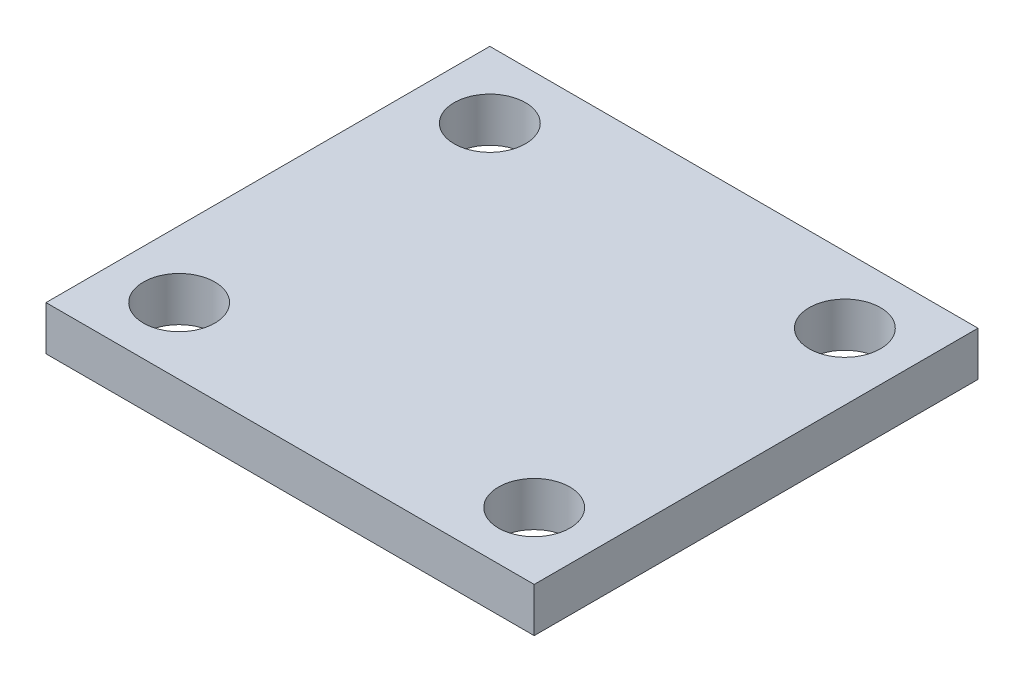
ISO-10303-21;
HEADER;
FILE_DESCRIPTION(('STEP AP214'),'2;1');
FILE_NAME('part.step','',(''),(''),'','','');
FILE_SCHEMA(('AUTOMOTIVE_DESIGN { 1 0 10303 214 1 1 1 1 }'));
ENDSEC;
DATA;
#1=APPLICATION_CONTEXT('core data for automotive mechanical design processes');
#2=APPLICATION_PROTOCOL_DEFINITION('international standard','automotive_design',2000,#1);
#3=PRODUCT_CONTEXT('',#1,'mechanical');
#4=PRODUCT('Part','Part','',(#3));
#5=PRODUCT_RELATED_PRODUCT_CATEGORY('part','',(#4));
#6=PRODUCT_DEFINITION_FORMATION('','',#4);
#7=PRODUCT_DEFINITION_CONTEXT('part definition',#1,'design');
#8=PRODUCT_DEFINITION('design','',#6,#7);
#9=PRODUCT_DEFINITION_SHAPE('','',#8);
#10=(LENGTH_UNIT() NAMED_UNIT(*) SI_UNIT(.MILLI.,.METRE.));
#11=(NAMED_UNIT(*) PLANE_ANGLE_UNIT() SI_UNIT($,.RADIAN.));
#12=(NAMED_UNIT(*) SI_UNIT($,.STERADIAN.) SOLID_ANGLE_UNIT());
#13=UNCERTAINTY_MEASURE_WITH_UNIT(LENGTH_MEASURE(1.E-05),#10,'distance_accuracy_value','');
#14=(GEOMETRIC_REPRESENTATION_CONTEXT(3) GLOBAL_UNCERTAINTY_ASSIGNED_CONTEXT((#13)) GLOBAL_UNIT_ASSIGNED_CONTEXT((#10,
#11,#12)) REPRESENTATION_CONTEXT('',''));
#15=CARTESIAN_POINT('',(0.,0.,0.));
#16=DIRECTION('',(0.,0.,1.));
#17=DIRECTION('',(1.,0.,0.));
#18=AXIS2_PLACEMENT_3D('',#15,#16,#17);
#19=CARTESIAN_POINT('',(17.4625,1.5875,15.875));
#20=DIRECTION('',(-1.,0.,0.));
#21=DIRECTION('',(0.,0.,1.));
#22=AXIS2_PLACEMENT_3D('',#19,#20,#21);
#23=PLANE('',#22);
#24=DIRECTION('',(0.,0.,-1.));
#25=VECTOR('',#24,1.);
#26=CARTESIAN_POINT('',(17.4625,-1.5875,15.875));
#27=LINE('',#26,#25);
#28=CARTESIAN_POINT('',(17.4625,-1.5875,15.875));
#29=VERTEX_POINT('',#28);
#30=CARTESIAN_POINT('',(17.4625,-1.5875,-15.875));
#31=VERTEX_POINT('',#30);
#32=EDGE_CURVE('E96',#29,#31,#27,.T.);
#33=ORIENTED_EDGE('',*,*,#32,.T.);
#34=DIRECTION('',(0.,-1.,0.));
#35=VECTOR('',#34,1.);
#36=CARTESIAN_POINT('',(17.4625,1.5875,-15.875));
#37=LINE('',#36,#35);
#38=CARTESIAN_POINT('',(17.4625,1.5875,-15.875));
#39=VERTEX_POINT('',#38);
#40=EDGE_CURVE('E11',#39,#31,#37,.T.);
#41=ORIENTED_EDGE('',*,*,#40,.F.);
#42=DIRECTION('',(0.,0.,-1.));
#43=VECTOR('',#42,1.);
#44=CARTESIAN_POINT('',(17.4625,1.5875,15.875));
#45=LINE('',#44,#43);
#46=CARTESIAN_POINT('',(17.4625,1.5875,15.875));
#47=VERTEX_POINT('',#46);
#48=EDGE_CURVE('E84',#47,#39,#45,.T.);
#49=ORIENTED_EDGE('',*,*,#48,.F.);
#50=DIRECTION('',(0.,-1.,0.));
#51=VECTOR('',#50,1.);
#52=CARTESIAN_POINT('',(17.4625,1.5875,15.875));
#53=LINE('',#52,#51);
#54=EDGE_CURVE('E92',#47,#29,#53,.T.);
#55=ORIENTED_EDGE('',*,*,#54,.T.);
#56=EDGE_LOOP('',(#33,#41,#49,#55));
#57=FACE_BOUND('',#56,.T.);
#58=ADVANCED_FACE('F33',(#57),#23,.F.);
#59=CARTESIAN_POINT('',(-17.4625,1.5875,-15.875));
#60=DIRECTION('',(0.,0.,1.));
#61=DIRECTION('',(1.,0.,0.));
#62=AXIS2_PLACEMENT_3D('',#59,#60,#61);
#63=PLANE('',#62);
#64=DIRECTION('',(-1.,0.,0.));
#65=VECTOR('',#64,1.);
#66=CARTESIAN_POINT('',(-17.4625,-1.5875,-15.875));
#67=LINE('',#66,#65);
#68=CARTESIAN_POINT('',(-17.4625,-1.5875,-15.875));
#69=VERTEX_POINT('',#68);
#70=EDGE_CURVE('E88',#31,#69,#67,.T.);
#71=ORIENTED_EDGE('',*,*,#70,.T.);
#72=DIRECTION('',(0.,-1.,0.));
#73=VECTOR('',#72,1.);
#74=CARTESIAN_POINT('',(-17.4625,1.5875,-15.875));
#75=LINE('',#74,#73);
#76=CARTESIAN_POINT('',(-17.4625,1.5875,-15.875));
#77=VERTEX_POINT('',#76);
#78=EDGE_CURVE('E41',#77,#69,#75,.T.);
#79=ORIENTED_EDGE('',*,*,#78,.F.);
#80=DIRECTION('',(-1.,0.,0.));
#81=VECTOR('',#80,1.);
#82=CARTESIAN_POINT('',(-17.4625,1.5875,-15.875));
#83=LINE('',#82,#81);
#84=EDGE_CURVE('E79',#39,#77,#83,.T.);
#85=ORIENTED_EDGE('',*,*,#84,.F.);
#86=ORIENTED_EDGE('',*,*,#40,.T.);
#87=EDGE_LOOP('',(#71,#79,#85,#86));
#88=FACE_BOUND('',#87,.T.);
#89=ADVANCED_FACE('F87',(#88),#63,.F.);
#90=CARTESIAN_POINT('',(-17.4625,1.5875,15.875));
#91=DIRECTION('',(1.,0.,0.));
#92=DIRECTION('',(0.,0.,-1.));
#93=AXIS2_PLACEMENT_3D('',#90,#91,#92);
#94=PLANE('',#93);
#95=DIRECTION('',(0.,0.,1.));
#96=VECTOR('',#95,1.);
#97=CARTESIAN_POINT('',(-17.4625,-1.5875,15.875));
#98=LINE('',#97,#96);
#99=CARTESIAN_POINT('',(-17.4625,-1.5875,15.875));
#100=VERTEX_POINT('',#99);
#101=EDGE_CURVE('E66',#69,#100,#98,.T.);
#102=ORIENTED_EDGE('',*,*,#101,.T.);
#103=DIRECTION('',(0.,-1.,0.));
#104=VECTOR('',#103,1.);
#105=CARTESIAN_POINT('',(-17.4625,1.5875,15.875));
#106=LINE('',#105,#104);
#107=CARTESIAN_POINT('',(-17.4625,1.5875,15.875));
#108=VERTEX_POINT('',#107);
#109=EDGE_CURVE('E89',#108,#100,#106,.T.);
#110=ORIENTED_EDGE('',*,*,#109,.F.);
#111=DIRECTION('',(0.,0.,1.));
#112=VECTOR('',#111,1.);
#113=CARTESIAN_POINT('',(-17.4625,1.5875,15.875));
#114=LINE('',#113,#112);
#115=EDGE_CURVE('E82',#77,#108,#114,.T.);
#116=ORIENTED_EDGE('',*,*,#115,.F.);
#117=ORIENTED_EDGE('',*,*,#78,.T.);
#118=EDGE_LOOP('',(#102,#110,#116,#117));
#119=FACE_BOUND('',#118,.T.);
#120=ADVANCED_FACE('F90',(#119),#94,.F.);
#121=CARTESIAN_POINT('',(-17.4625,1.5875,15.875));
#122=DIRECTION('',(0.,0.,-1.));
#123=DIRECTION('',(-1.,0.,0.));
#124=AXIS2_PLACEMENT_3D('',#121,#122,#123);
#125=PLANE('',#124);
#126=DIRECTION('',(1.,0.,0.));
#127=VECTOR('',#126,1.);
#128=CARTESIAN_POINT('',(-17.4625,-1.5875,15.875));
#129=LINE('',#128,#127);
#130=EDGE_CURVE('E72',#100,#29,#129,.T.);
#131=ORIENTED_EDGE('',*,*,#130,.T.);
#132=ORIENTED_EDGE('',*,*,#54,.F.);
#133=DIRECTION('',(1.,0.,0.));
#134=VECTOR('',#133,1.);
#135=CARTESIAN_POINT('',(-17.4625,1.5875,15.875));
#136=LINE('',#135,#134);
#137=EDGE_CURVE('E49',#108,#47,#136,.T.);
#138=ORIENTED_EDGE('',*,*,#137,.F.);
#139=ORIENTED_EDGE('',*,*,#109,.T.);
#140=EDGE_LOOP('',(#131,#132,#138,#139));
#141=FACE_BOUND('',#140,.T.);
#142=ADVANCED_FACE('F104',(#141),#125,.F.);
#143=CARTESIAN_POINT('',(0.,1.5875,0.));
#144=DIRECTION('',(0.,-1.,0.));
#145=DIRECTION('',(0.,0.,-1.));
#146=AXIS2_PLACEMENT_3D('',#143,#144,#145);
#147=PLANE('',#146);
#148=CARTESIAN_POINT('',(-12.7,1.5875,-11.1125));
#149=DIRECTION('',(0.,1.,0.));
#150=DIRECTION('',(0.,0.,1.));
#151=AXIS2_PLACEMENT_3D('',#148,#149,#150);
#152=CIRCLE('',#151,2.5527);
#153=CARTESIAN_POINT('',(-12.7,1.5875,-8.5598));
#154=VERTEX_POINT('',#153);
#155=EDGE_CURVE('E130',#154,#154,#152,.T.);
#156=ORIENTED_EDGE('',*,*,#155,.F.);
#157=EDGE_LOOP('',(#156));
#158=FACE_BOUND('',#157,.T.);
#159=CARTESIAN_POINT('',(12.7,1.5875,-11.1125));
#160=DIRECTION('',(0.,1.,0.));
#161=DIRECTION('',(0.,0.,1.));
#162=AXIS2_PLACEMENT_3D('',#159,#160,#161);
#163=CIRCLE('',#162,2.5527);
#164=CARTESIAN_POINT('',(12.7,1.5875,-8.5598));
#165=VERTEX_POINT('',#164);
#166=EDGE_CURVE('E124',#165,#165,#163,.T.);
#167=ORIENTED_EDGE('',*,*,#166,.F.);
#168=EDGE_LOOP('',(#167));
#169=FACE_BOUND('',#168,.T.);
#170=CARTESIAN_POINT('',(12.7,1.5875,11.1125));
#171=DIRECTION('',(0.,1.,0.));
#172=DIRECTION('',(0.,0.,1.));
#173=AXIS2_PLACEMENT_3D('',#170,#171,#172);
#174=CIRCLE('',#173,2.5527);
#175=CARTESIAN_POINT('',(12.7,1.5875,13.6652));
#176=VERTEX_POINT('',#175);
#177=EDGE_CURVE('E118',#176,#176,#174,.T.);
#178=ORIENTED_EDGE('',*,*,#177,.F.);
#179=EDGE_LOOP('',(#178));
#180=FACE_BOUND('',#179,.T.);
#181=CARTESIAN_POINT('',(-12.7,1.5875,11.1125));
#182=DIRECTION('',(0.,1.,0.));
#183=DIRECTION('',(0.,0.,1.));
#184=AXIS2_PLACEMENT_3D('',#181,#182,#183);
#185=CIRCLE('',#184,2.5527);
#186=CARTESIAN_POINT('',(-12.7,1.5875,13.6652));
#187=VERTEX_POINT('',#186);
#188=EDGE_CURVE('E112',#187,#187,#185,.T.);
#189=ORIENTED_EDGE('',*,*,#188,.F.);
#190=EDGE_LOOP('',(#189));
#191=FACE_BOUND('',#190,.T.);
#192=ORIENTED_EDGE('',*,*,#48,.T.);
#193=ORIENTED_EDGE('',*,*,#84,.T.);
#194=ORIENTED_EDGE('',*,*,#115,.T.);
#195=ORIENTED_EDGE('',*,*,#137,.T.);
#196=EDGE_LOOP('',(#192,#193,#194,#195));
#197=FACE_BOUND('',#196,.T.);
#198=ADVANCED_FACE('F80',(#158,#169,#180,#191,#197),#147,.F.);
#199=CARTESIAN_POINT('',(0.,-1.5875,0.));
#200=DIRECTION('',(0.,-1.,0.));
#201=DIRECTION('',(0.,0.,-1.));
#202=AXIS2_PLACEMENT_3D('',#199,#200,#201);
#203=PLANE('',#202);
#204=CARTESIAN_POINT('',(-12.7,-1.5875,-11.1125));
#205=DIRECTION('',(0.,1.,0.));
#206=DIRECTION('',(0.,0.,1.));
#207=AXIS2_PLACEMENT_3D('',#204,#205,#206);
#208=CIRCLE('',#207,2.5527);
#209=CARTESIAN_POINT('',(-12.7,-1.5875,-8.5598));
#210=VERTEX_POINT('',#209);
#211=EDGE_CURVE('E127',#210,#210,#208,.T.);
#212=ORIENTED_EDGE('',*,*,#211,.T.);
#213=EDGE_LOOP('',(#212));
#214=FACE_BOUND('',#213,.T.);
#215=CARTESIAN_POINT('',(12.7,-1.5875,-11.1125));
#216=DIRECTION('',(0.,1.,0.));
#217=DIRECTION('',(0.,0.,1.));
#218=AXIS2_PLACEMENT_3D('',#215,#216,#217);
#219=CIRCLE('',#218,2.5527);
#220=CARTESIAN_POINT('',(12.7,-1.5875,-8.5598));
#221=VERTEX_POINT('',#220);
#222=EDGE_CURVE('E121',#221,#221,#219,.T.);
#223=ORIENTED_EDGE('',*,*,#222,.T.);
#224=EDGE_LOOP('',(#223));
#225=FACE_BOUND('',#224,.T.);
#226=CARTESIAN_POINT('',(12.7,-1.5875,11.1125));
#227=DIRECTION('',(0.,1.,0.));
#228=DIRECTION('',(0.,0.,1.));
#229=AXIS2_PLACEMENT_3D('',#226,#227,#228);
#230=CIRCLE('',#229,2.5527);
#231=CARTESIAN_POINT('',(12.7,-1.5875,13.6652));
#232=VERTEX_POINT('',#231);
#233=EDGE_CURVE('E115',#232,#232,#230,.T.);
#234=ORIENTED_EDGE('',*,*,#233,.T.);
#235=EDGE_LOOP('',(#234));
#236=FACE_BOUND('',#235,.T.);
#237=CARTESIAN_POINT('',(-12.7,-1.5875,11.1125));
#238=DIRECTION('',(0.,1.,0.));
#239=DIRECTION('',(0.,0.,1.));
#240=AXIS2_PLACEMENT_3D('',#237,#238,#239);
#241=CIRCLE('',#240,2.5527);
#242=CARTESIAN_POINT('',(-12.7,-1.5875,13.6652));
#243=VERTEX_POINT('',#242);
#244=EDGE_CURVE('E99',#243,#243,#241,.T.);
#245=ORIENTED_EDGE('',*,*,#244,.T.);
#246=EDGE_LOOP('',(#245));
#247=FACE_BOUND('',#246,.T.);
#248=ORIENTED_EDGE('',*,*,#32,.F.);
#249=ORIENTED_EDGE('',*,*,#130,.F.);
#250=ORIENTED_EDGE('',*,*,#101,.F.);
#251=ORIENTED_EDGE('',*,*,#70,.F.);
#252=EDGE_LOOP('',(#248,#249,#250,#251));
#253=FACE_BOUND('',#252,.T.);
#254=ADVANCED_FACE('F107',(#214,#225,#236,#247,#253),#203,.T.);
#255=CARTESIAN_POINT('',(-12.7,1.5875,11.1125));
#256=DIRECTION('',(0.,1.,0.));
#257=DIRECTION('',(0.,0.,1.));
#258=AXIS2_PLACEMENT_3D('',#255,#256,#257);
#259=CYLINDRICAL_SURFACE('',#258,2.5527);
#260=ORIENTED_EDGE('',*,*,#244,.F.);
#261=EDGE_LOOP('',(#260));
#262=FACE_BOUND('',#261,.T.);
#263=ORIENTED_EDGE('',*,*,#188,.T.);
#264=EDGE_LOOP('',(#263));
#265=FACE_BOUND('',#264,.T.);
#266=ADVANCED_FACE('F145',(#262,#265),#259,.F.);
#267=CARTESIAN_POINT('',(12.7,1.5875,11.1125));
#268=DIRECTION('',(0.,1.,0.));
#269=DIRECTION('',(0.,0.,1.));
#270=AXIS2_PLACEMENT_3D('',#267,#268,#269);
#271=CYLINDRICAL_SURFACE('',#270,2.5527);
#272=ORIENTED_EDGE('',*,*,#233,.F.);
#273=EDGE_LOOP('',(#272));
#274=FACE_BOUND('',#273,.T.);
#275=ORIENTED_EDGE('',*,*,#177,.T.);
#276=EDGE_LOOP('',(#275));
#277=FACE_BOUND('',#276,.T.);
#278=ADVANCED_FACE('F147',(#274,#277),#271,.F.);
#279=CARTESIAN_POINT('',(12.7,1.5875,-11.1125));
#280=DIRECTION('',(0.,1.,0.));
#281=DIRECTION('',(0.,0.,1.));
#282=AXIS2_PLACEMENT_3D('',#279,#280,#281);
#283=CYLINDRICAL_SURFACE('',#282,2.5527);
#284=ORIENTED_EDGE('',*,*,#222,.F.);
#285=EDGE_LOOP('',(#284));
#286=FACE_BOUND('',#285,.T.);
#287=ORIENTED_EDGE('',*,*,#166,.T.);
#288=EDGE_LOOP('',(#287));
#289=FACE_BOUND('',#288,.T.);
#290=ADVANCED_FACE('F154',(#286,#289),#283,.F.);
#291=CARTESIAN_POINT('',(-12.7,1.5875,-11.1125));
#292=DIRECTION('',(0.,1.,0.));
#293=DIRECTION('',(0.,0.,1.));
#294=AXIS2_PLACEMENT_3D('',#291,#292,#293);
#295=CYLINDRICAL_SURFACE('',#294,2.5527);
#296=ORIENTED_EDGE('',*,*,#211,.F.);
#297=EDGE_LOOP('',(#296));
#298=FACE_BOUND('',#297,.T.);
#299=ORIENTED_EDGE('',*,*,#155,.T.);
#300=EDGE_LOOP('',(#299));
#301=FACE_BOUND('',#300,.T.);
#302=ADVANCED_FACE('F134',(#298,#301),#295,.F.);
#303=CLOSED_SHELL('',(#58,#89,#120,#142,#198,#254,#266,#278,#290,#302));
#304=MANIFOLD_SOLID_BREP('B2',#303);
#305=ADVANCED_BREP_SHAPE_REPRESENTATION('',(#18,#304),#14);
#306=SHAPE_DEFINITION_REPRESENTATION(#9,#305);
ENDSEC;
END-ISO-10303-21;
